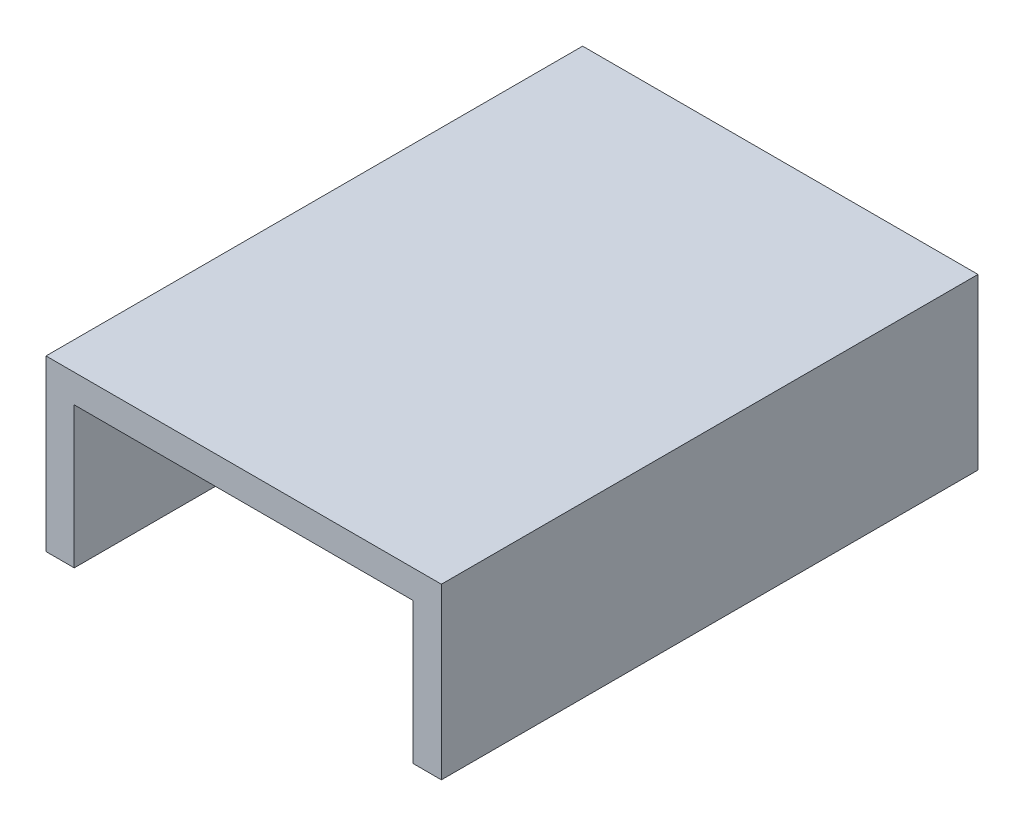
ISO-10303-21;
HEADER;
FILE_DESCRIPTION(('STEP AP214'),'2;1');
FILE_NAME('part.step','',(''),(''),'','','');
FILE_SCHEMA(('AUTOMOTIVE_DESIGN { 1 0 10303 214 1 1 1 1 }'));
ENDSEC;
DATA;
#1=APPLICATION_CONTEXT('core data for automotive mechanical design processes');
#2=APPLICATION_PROTOCOL_DEFINITION('international standard','automotive_design',2000,#1);
#3=PRODUCT_CONTEXT('',#1,'mechanical');
#4=PRODUCT('Part','Part','',(#3));
#5=PRODUCT_RELATED_PRODUCT_CATEGORY('part','',(#4));
#6=PRODUCT_DEFINITION_FORMATION('','',#4);
#7=PRODUCT_DEFINITION_CONTEXT('part definition',#1,'design');
#8=PRODUCT_DEFINITION('design','',#6,#7);
#9=PRODUCT_DEFINITION_SHAPE('','',#8);
#10=(LENGTH_UNIT() NAMED_UNIT(*) SI_UNIT(.MILLI.,.METRE.));
#11=(NAMED_UNIT(*) PLANE_ANGLE_UNIT() SI_UNIT($,.RADIAN.));
#12=(NAMED_UNIT(*) SI_UNIT($,.STERADIAN.) SOLID_ANGLE_UNIT());
#13=UNCERTAINTY_MEASURE_WITH_UNIT(LENGTH_MEASURE(1.E-05),#10,'distance_accuracy_value','');
#14=(GEOMETRIC_REPRESENTATION_CONTEXT(3) GLOBAL_UNCERTAINTY_ASSIGNED_CONTEXT((#13)) GLOBAL_UNIT_ASSIGNED_CONTEXT((#10,
#11,#12)) REPRESENTATION_CONTEXT('',''));
#15=CARTESIAN_POINT('',(0.,0.,0.));
#16=DIRECTION('',(0.,0.,1.));
#17=DIRECTION('',(1.,0.,0.));
#18=AXIS2_PLACEMENT_3D('',#15,#16,#17);
#19=CARTESIAN_POINT('',(35.,30.,47.5));
#20=DIRECTION('',(-1.,0.,0.));
#21=DIRECTION('',(0.,0.,1.));
#22=AXIS2_PLACEMENT_3D('',#19,#20,#21);
#23=PLANE('',#22);
#24=DIRECTION('',(0.,0.,-1.));
#25=VECTOR('',#24,1.);
#26=CARTESIAN_POINT('',(35.,0.,47.5));
#27=LINE('',#26,#25);
#28=CARTESIAN_POINT('',(35.,0.,47.5));
#29=VERTEX_POINT('',#28);
#30=CARTESIAN_POINT('',(35.,0.,-47.5));
#31=VERTEX_POINT('',#30);
#32=EDGE_CURVE('E155',#29,#31,#27,.T.);
#33=ORIENTED_EDGE('',*,*,#32,.T.);
#34=DIRECTION('',(0.,-1.,0.));
#35=VECTOR('',#34,1.);
#36=CARTESIAN_POINT('',(35.,30.,-47.5));
#37=LINE('',#36,#35);
#38=CARTESIAN_POINT('',(35.,30.,-47.5));
#39=VERTEX_POINT('',#38);
#40=EDGE_CURVE('E11',#39,#31,#37,.T.);
#41=ORIENTED_EDGE('',*,*,#40,.F.);
#42=DIRECTION('',(0.,0.,-1.));
#43=VECTOR('',#42,1.);
#44=CARTESIAN_POINT('',(35.,30.,47.5));
#45=LINE('',#44,#43);
#46=CARTESIAN_POINT('',(35.,30.,47.5));
#47=VERTEX_POINT('',#46);
#48=EDGE_CURVE('E143',#47,#39,#45,.T.);
#49=ORIENTED_EDGE('',*,*,#48,.F.);
#50=DIRECTION('',(0.,-1.,0.));
#51=VECTOR('',#50,1.);
#52=CARTESIAN_POINT('',(35.,30.,47.5));
#53=LINE('',#52,#51);
#54=EDGE_CURVE('E154',#47,#29,#53,.T.);
#55=ORIENTED_EDGE('',*,*,#54,.T.);
#56=EDGE_LOOP('',(#33,#41,#49,#55));
#57=FACE_BOUND('',#56,.T.);
#58=ADVANCED_FACE('F39',(#57),#23,.F.);
#59=CARTESIAN_POINT('',(-35.,30.,-47.5));
#60=DIRECTION('',(0.,0.,1.));
#61=DIRECTION('',(1.,0.,0.));
#62=AXIS2_PLACEMENT_3D('',#59,#60,#61);
#63=PLANE('',#62);
#64=DIRECTION('',(-1.,0.,0.));
#65=VECTOR('',#64,1.);
#66=CARTESIAN_POINT('',(-35.,0.,-47.5));
#67=LINE('',#66,#65);
#68=CARTESIAN_POINT('',(-35.,0.,-47.5));
#69=VERTEX_POINT('',#68);
#70=EDGE_CURVE('E159',#31,#69,#67,.T.);
#71=ORIENTED_EDGE('',*,*,#70,.T.);
#72=DIRECTION('',(0.,-1.,0.));
#73=VECTOR('',#72,1.);
#74=CARTESIAN_POINT('',(-35.,30.,-47.5));
#75=LINE('',#74,#73);
#76=CARTESIAN_POINT('',(-35.,30.,-47.5));
#77=VERTEX_POINT('',#76);
#78=EDGE_CURVE('E47',#77,#69,#75,.T.);
#79=ORIENTED_EDGE('',*,*,#78,.F.);
#80=DIRECTION('',(-1.,0.,0.));
#81=VECTOR('',#80,1.);
#82=CARTESIAN_POINT('',(-35.,30.,-47.5));
#83=LINE('',#82,#81);
#84=EDGE_CURVE('E91',#39,#77,#83,.T.);
#85=ORIENTED_EDGE('',*,*,#84,.F.);
#86=ORIENTED_EDGE('',*,*,#40,.T.);
#87=EDGE_LOOP('',(#71,#79,#85,#86));
#88=FACE_BOUND('',#87,.T.);
#89=ADVANCED_FACE('F200',(#88),#63,.F.);
#90=CARTESIAN_POINT('',(-35.,30.,47.5));
#91=DIRECTION('',(1.,0.,0.));
#92=DIRECTION('',(0.,0.,-1.));
#93=AXIS2_PLACEMENT_3D('',#90,#91,#92);
#94=PLANE('',#93);
#95=DIRECTION('',(0.,0.,1.));
#96=VECTOR('',#95,1.);
#97=CARTESIAN_POINT('',(-35.,0.,47.5));
#98=LINE('',#97,#96);
#99=CARTESIAN_POINT('',(-35.,0.,47.5));
#100=VERTEX_POINT('',#99);
#101=EDGE_CURVE('E162',#69,#100,#98,.T.);
#102=ORIENTED_EDGE('',*,*,#101,.T.);
#103=DIRECTION('',(0.,-1.,0.));
#104=VECTOR('',#103,1.);
#105=CARTESIAN_POINT('',(-35.,30.,47.5));
#106=LINE('',#105,#104);
#107=CARTESIAN_POINT('',(-35.,30.,47.5));
#108=VERTEX_POINT('',#107);
#109=EDGE_CURVE('E170',#108,#100,#106,.T.);
#110=ORIENTED_EDGE('',*,*,#109,.F.);
#111=DIRECTION('',(0.,0.,1.));
#112=VECTOR('',#111,1.);
#113=CARTESIAN_POINT('',(-35.,30.,47.5));
#114=LINE('',#113,#112);
#115=EDGE_CURVE('E149',#77,#108,#114,.T.);
#116=ORIENTED_EDGE('',*,*,#115,.F.);
#117=ORIENTED_EDGE('',*,*,#78,.T.);
#118=EDGE_LOOP('',(#102,#110,#116,#117));
#119=FACE_BOUND('',#118,.T.);
#120=ADVANCED_FACE('F178',(#119),#94,.F.);
#121=CARTESIAN_POINT('',(-35.,30.,47.5));
#122=DIRECTION('',(0.,0.,-1.));
#123=DIRECTION('',(-1.,0.,0.));
#124=AXIS2_PLACEMENT_3D('',#121,#122,#123);
#125=PLANE('',#124);
#126=DIRECTION('',(1.,0.,0.));
#127=VECTOR('',#126,1.);
#128=CARTESIAN_POINT('',(-35.,0.,47.5));
#129=LINE('',#128,#127);
#130=CARTESIAN_POINT('',(-30.,0.,47.5));
#131=VERTEX_POINT('',#130);
#132=EDGE_CURVE('E146',#100,#131,#129,.T.);
#133=ORIENTED_EDGE('',*,*,#132,.T.);
#134=DIRECTION('',(0.,-1.,0.));
#135=VECTOR('',#134,1.);
#136=CARTESIAN_POINT('',(-30.,0.,47.5));
#137=LINE('',#136,#135);
#138=CARTESIAN_POINT('',(-30.,25.,47.5));
#139=VERTEX_POINT('',#138);
#140=EDGE_CURVE('E184',#139,#131,#137,.T.);
#141=ORIENTED_EDGE('',*,*,#140,.F.);
#142=DIRECTION('',(-1.,0.,0.));
#143=VECTOR('',#142,1.);
#144=CARTESIAN_POINT('',(-30.,25.,47.5));
#145=LINE('',#144,#143);
#146=CARTESIAN_POINT('',(30.,25.,47.5));
#147=VERTEX_POINT('',#146);
#148=EDGE_CURVE('E261',#147,#139,#145,.T.);
#149=ORIENTED_EDGE('',*,*,#148,.F.);
#150=DIRECTION('',(0.,1.,0.));
#151=VECTOR('',#150,1.);
#152=CARTESIAN_POINT('',(30.,0.,47.5));
#153=LINE('',#152,#151);
#154=CARTESIAN_POINT('',(30.,0.,47.5));
#155=VERTEX_POINT('',#154);
#156=EDGE_CURVE('E263',#155,#147,#153,.T.);
#157=ORIENTED_EDGE('',*,*,#156,.F.);
#158=EDGE_CURVE('E84',#155,#29,#129,.T.);
#159=ORIENTED_EDGE('',*,*,#158,.T.);
#160=ORIENTED_EDGE('',*,*,#54,.F.);
#161=DIRECTION('',(1.,0.,0.));
#162=VECTOR('',#161,1.);
#163=CARTESIAN_POINT('',(-35.,30.,47.5));
#164=LINE('',#163,#162);
#165=EDGE_CURVE('E63',#108,#47,#164,.T.);
#166=ORIENTED_EDGE('',*,*,#165,.F.);
#167=ORIENTED_EDGE('',*,*,#109,.T.);
#168=EDGE_LOOP('',(#133,#141,#149,#157,#159,#160,#166,#167));
#169=FACE_BOUND('',#168,.T.);
#170=ADVANCED_FACE('F182',(#169),#125,.F.);
#171=CARTESIAN_POINT('',(0.,30.,0.));
#172=DIRECTION('',(0.,-1.,0.));
#173=DIRECTION('',(0.,0.,-1.));
#174=AXIS2_PLACEMENT_3D('',#171,#172,#173);
#175=PLANE('',#174);
#176=ORIENTED_EDGE('',*,*,#48,.T.);
#177=ORIENTED_EDGE('',*,*,#84,.T.);
#178=ORIENTED_EDGE('',*,*,#115,.T.);
#179=ORIENTED_EDGE('',*,*,#165,.T.);
#180=EDGE_LOOP('',(#176,#177,#178,#179));
#181=FACE_BOUND('',#180,.T.);
#182=ADVANCED_FACE('F188',(#181),#175,.F.);
#183=CARTESIAN_POINT('',(0.,0.,0.));
#184=DIRECTION('',(0.,-1.,0.));
#185=DIRECTION('',(0.,0.,-1.));
#186=AXIS2_PLACEMENT_3D('',#183,#184,#185);
#187=PLANE('',#186);
#188=DIRECTION('',(0.,0.,1.));
#189=VECTOR('',#188,1.);
#190=CARTESIAN_POINT('',(-30.,0.,-40.));
#191=LINE('',#190,#189);
#192=CARTESIAN_POINT('',(-30.,0.,-40.));
#193=VERTEX_POINT('',#192);
#194=EDGE_CURVE('E134',#193,#131,#191,.T.);
#195=ORIENTED_EDGE('',*,*,#194,.T.);
#196=ORIENTED_EDGE('',*,*,#132,.F.);
#197=ORIENTED_EDGE('',*,*,#101,.F.);
#198=ORIENTED_EDGE('',*,*,#70,.F.);
#199=ORIENTED_EDGE('',*,*,#32,.F.);
#200=ORIENTED_EDGE('',*,*,#158,.F.);
#201=DIRECTION('',(0.,0.,1.));
#202=VECTOR('',#201,1.);
#203=CARTESIAN_POINT('',(30.,0.,-40.));
#204=LINE('',#203,#202);
#205=CARTESIAN_POINT('',(30.,0.,-40.));
#206=VERTEX_POINT('',#205);
#207=EDGE_CURVE('E118',#206,#155,#204,.T.);
#208=ORIENTED_EDGE('',*,*,#207,.F.);
#209=DIRECTION('',(1.,0.,0.));
#210=VECTOR('',#209,1.);
#211=CARTESIAN_POINT('',(-30.,0.,-40.));
#212=LINE('',#211,#210);
#213=EDGE_CURVE('E123',#193,#206,#212,.T.);
#214=ORIENTED_EDGE('',*,*,#213,.F.);
#215=EDGE_LOOP('',(#195,#196,#197,#198,#199,#200,#208,#214));
#216=FACE_BOUND('',#215,.T.);
#217=ADVANCED_FACE('F131',(#216),#187,.T.);
#218=CARTESIAN_POINT('',(-30.,0.,-40.));
#219=DIRECTION('',(-1.,0.,0.));
#220=DIRECTION('',(0.,0.,1.));
#221=AXIS2_PLACEMENT_3D('',#218,#219,#220);
#222=PLANE('',#221);
#223=ORIENTED_EDGE('',*,*,#140,.T.);
#224=ORIENTED_EDGE('',*,*,#194,.F.);
#225=DIRECTION('',(0.,-1.,0.));
#226=VECTOR('',#225,1.);
#227=CARTESIAN_POINT('',(-30.,0.,-40.));
#228=LINE('',#227,#226);
#229=CARTESIAN_POINT('',(-30.,25.,-40.));
#230=VERTEX_POINT('',#229);
#231=EDGE_CURVE('E54',#230,#193,#228,.T.);
#232=ORIENTED_EDGE('',*,*,#231,.F.);
#233=DIRECTION('',(0.,0.,1.));
#234=VECTOR('',#233,1.);
#235=CARTESIAN_POINT('',(-30.,25.,-40.));
#236=LINE('',#235,#234);
#237=EDGE_CURVE('E138',#230,#139,#236,.T.);
#238=ORIENTED_EDGE('',*,*,#237,.T.);
#239=EDGE_LOOP('',(#223,#224,#232,#238));
#240=FACE_BOUND('',#239,.T.);
#241=ADVANCED_FACE('F195',(#240),#222,.F.);
#242=CARTESIAN_POINT('',(-30.,25.,-40.));
#243=DIRECTION('',(0.,1.,0.));
#244=DIRECTION('',(0.,0.,1.));
#245=AXIS2_PLACEMENT_3D('',#242,#243,#244);
#246=PLANE('',#245);
#247=ORIENTED_EDGE('',*,*,#148,.T.);
#248=ORIENTED_EDGE('',*,*,#237,.F.);
#249=DIRECTION('',(-1.,0.,0.));
#250=VECTOR('',#249,1.);
#251=CARTESIAN_POINT('',(-30.,25.,-40.));
#252=LINE('',#251,#250);
#253=CARTESIAN_POINT('',(30.,25.,-40.));
#254=VERTEX_POINT('',#253);
#255=EDGE_CURVE('E122',#254,#230,#252,.T.);
#256=ORIENTED_EDGE('',*,*,#255,.F.);
#257=DIRECTION('',(0.,0.,1.));
#258=VECTOR('',#257,1.);
#259=CARTESIAN_POINT('',(30.,25.,-40.));
#260=LINE('',#259,#258);
#261=EDGE_CURVE('E119',#254,#147,#260,.T.);
#262=ORIENTED_EDGE('',*,*,#261,.T.);
#263=EDGE_LOOP('',(#247,#248,#256,#262));
#264=FACE_BOUND('',#263,.T.);
#265=ADVANCED_FACE('F231',(#264),#246,.F.);
#266=CARTESIAN_POINT('',(30.,0.,-40.));
#267=DIRECTION('',(1.,0.,0.));
#268=DIRECTION('',(0.,0.,-1.));
#269=AXIS2_PLACEMENT_3D('',#266,#267,#268);
#270=PLANE('',#269);
#271=ORIENTED_EDGE('',*,*,#156,.T.);
#272=ORIENTED_EDGE('',*,*,#261,.F.);
#273=DIRECTION('',(0.,1.,0.));
#274=VECTOR('',#273,1.);
#275=CARTESIAN_POINT('',(30.,0.,-40.));
#276=LINE('',#275,#274);
#277=EDGE_CURVE('E114',#206,#254,#276,.T.);
#278=ORIENTED_EDGE('',*,*,#277,.F.);
#279=ORIENTED_EDGE('',*,*,#207,.T.);
#280=EDGE_LOOP('',(#271,#272,#278,#279));
#281=FACE_BOUND('',#280,.T.);
#282=ADVANCED_FACE('F116',(#281),#270,.F.);
#283=CARTESIAN_POINT('',(0.,0.,-40.));
#284=DIRECTION('',(0.,0.,-1.));
#285=DIRECTION('',(-1.,0.,0.));
#286=AXIS2_PLACEMENT_3D('',#283,#284,#285);
#287=PLANE('',#286);
#288=ORIENTED_EDGE('',*,*,#231,.T.);
#289=ORIENTED_EDGE('',*,*,#213,.T.);
#290=ORIENTED_EDGE('',*,*,#277,.T.);
#291=ORIENTED_EDGE('',*,*,#255,.T.);
#292=EDGE_LOOP('',(#288,#289,#290,#291));
#293=FACE_BOUND('',#292,.T.);
#294=ADVANCED_FACE('F126',(#293),#287,.F.);
#295=CLOSED_SHELL('',(#58,#89,#120,#170,#182,#217,#241,#265,#282,#294));
#296=MANIFOLD_SOLID_BREP('B2',#295);
#297=ADVANCED_BREP_SHAPE_REPRESENTATION('',(#18,#296),#14);
#298=SHAPE_DEFINITION_REPRESENTATION(#9,#297);
ENDSEC;
END-ISO-10303-21;
